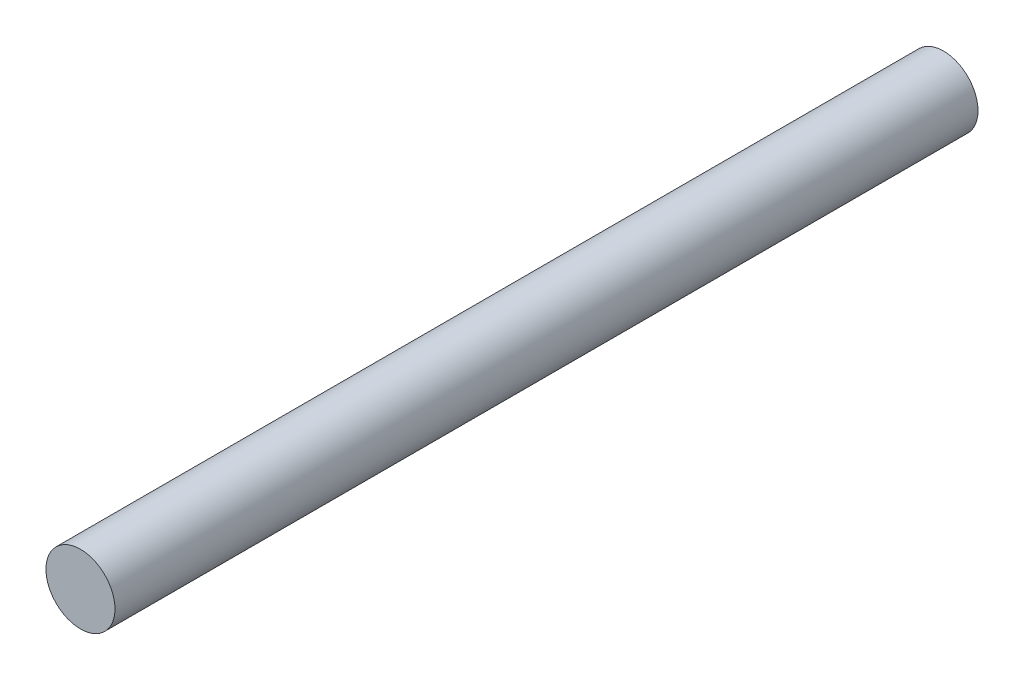
ISO-10303-21;
HEADER;
FILE_DESCRIPTION(('STEP AP214'),'2;1');
FILE_NAME('part.step','',(''),(''),'','','');
FILE_SCHEMA(('AUTOMOTIVE_DESIGN { 1 0 10303 214 1 1 1 1 }'));
ENDSEC;
DATA;
#1=APPLICATION_CONTEXT('core data for automotive mechanical design processes');
#2=APPLICATION_PROTOCOL_DEFINITION('international standard','automotive_design',2000,#1);
#3=PRODUCT_CONTEXT('',#1,'mechanical');
#4=PRODUCT('Part','Part','',(#3));
#5=PRODUCT_RELATED_PRODUCT_CATEGORY('part','',(#4));
#6=PRODUCT_DEFINITION_FORMATION('','',#4);
#7=PRODUCT_DEFINITION_CONTEXT('part definition',#1,'design');
#8=PRODUCT_DEFINITION('design','',#6,#7);
#9=PRODUCT_DEFINITION_SHAPE('','',#8);
#10=(LENGTH_UNIT() NAMED_UNIT(*) SI_UNIT(.MILLI.,.METRE.));
#11=(NAMED_UNIT(*) PLANE_ANGLE_UNIT() SI_UNIT($,.RADIAN.));
#12=(NAMED_UNIT(*) SI_UNIT($,.STERADIAN.) SOLID_ANGLE_UNIT());
#13=UNCERTAINTY_MEASURE_WITH_UNIT(LENGTH_MEASURE(1.E-05),#10,'distance_accuracy_value','');
#14=(GEOMETRIC_REPRESENTATION_CONTEXT(3) GLOBAL_UNCERTAINTY_ASSIGNED_CONTEXT((#13)) GLOBAL_UNIT_ASSIGNED_CONTEXT((#10,
#11,#12)) REPRESENTATION_CONTEXT('',''));
#15=CARTESIAN_POINT('',(0.,0.,0.));
#16=DIRECTION('',(0.,0.,1.));
#17=DIRECTION('',(1.,0.,0.));
#18=AXIS2_PLACEMENT_3D('',#15,#16,#17);
#19=CARTESIAN_POINT('',(0.,0.,150.));
#20=DIRECTION('',(0.,0.,-1.));
#21=DIRECTION('',(-1.,0.,0.));
#22=AXIS2_PLACEMENT_3D('',#19,#20,#21);
#23=CYLINDRICAL_SURFACE('',#22,6.);
#24=CARTESIAN_POINT('',(0.,0.,150.));
#25=DIRECTION('',(0.,0.,1.));
#26=DIRECTION('',(1.,0.,0.));
#27=AXIS2_PLACEMENT_3D('',#24,#25,#26);
#28=CIRCLE('',#27,6.);
#29=CARTESIAN_POINT('',(6.,0.,150.));
#30=VERTEX_POINT('',#29);
#31=EDGE_CURVE('E10',#30,#30,#28,.T.);
#32=ORIENTED_EDGE('',*,*,#31,.F.);
#33=EDGE_LOOP('',(#32));
#34=FACE_BOUND('',#33,.T.);
#35=CARTESIAN_POINT('',(0.,0.,0.));
#36=DIRECTION('',(0.,0.,1.));
#37=DIRECTION('',(1.,0.,0.));
#38=AXIS2_PLACEMENT_3D('',#35,#36,#37);
#39=CIRCLE('',#38,6.);
#40=CARTESIAN_POINT('',(6.,0.,0.));
#41=VERTEX_POINT('',#40);
#42=EDGE_CURVE('E46',#41,#41,#39,.T.);
#43=ORIENTED_EDGE('',*,*,#42,.T.);
#44=EDGE_LOOP('',(#43));
#45=FACE_BOUND('',#44,.T.);
#46=ADVANCED_FACE('F43',(#34,#45),#23,.T.);
#47=CARTESIAN_POINT('',(0.,0.,150.));
#48=DIRECTION('',(0.,0.,1.));
#49=DIRECTION('',(1.,0.,0.));
#50=AXIS2_PLACEMENT_3D('',#47,#48,#49);
#51=PLANE('',#50);
#52=ORIENTED_EDGE('',*,*,#31,.T.);
#53=EDGE_LOOP('',(#52));
#54=FACE_BOUND('',#53,.T.);
#55=ADVANCED_FACE('F60',(#54),#51,.T.);
#56=CARTESIAN_POINT('',(0.,0.,0.));
#57=DIRECTION('',(0.,0.,1.));
#58=DIRECTION('',(1.,0.,0.));
#59=AXIS2_PLACEMENT_3D('',#56,#57,#58);
#60=PLANE('',#59);
#61=ORIENTED_EDGE('',*,*,#42,.F.);
#62=EDGE_LOOP('',(#61));
#63=FACE_BOUND('',#62,.T.);
#64=ADVANCED_FACE('F58',(#63),#60,.F.);
#65=CLOSED_SHELL('',(#46,#55,#64));
#66=MANIFOLD_SOLID_BREP('B2',#65);
#67=ADVANCED_BREP_SHAPE_REPRESENTATION('',(#18,#66),#14);
#68=SHAPE_DEFINITION_REPRESENTATION(#9,#67);
ENDSEC;
END-ISO-10303-21;
